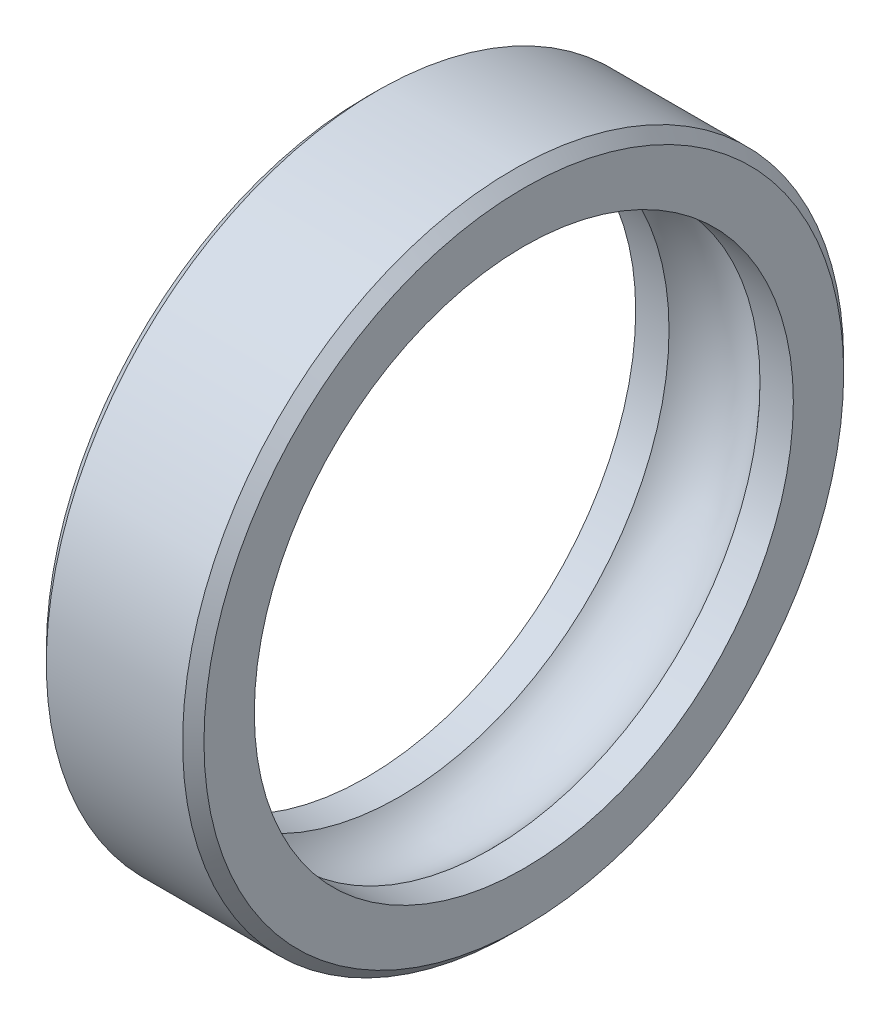
ISO-10303-21;
HEADER;
FILE_DESCRIPTION(('STEP AP214'),'2;1');
FILE_NAME('part.step','',(''),(''),'','','');
FILE_SCHEMA(('AUTOMOTIVE_DESIGN { 1 0 10303 214 1 1 1 1 }'));
ENDSEC;
DATA;
#1=APPLICATION_CONTEXT('core data for automotive mechanical design processes');
#2=APPLICATION_PROTOCOL_DEFINITION('international standard','automotive_design',2000,#1);
#3=PRODUCT_CONTEXT('',#1,'mechanical');
#4=PRODUCT('Part','Part','',(#3));
#5=PRODUCT_RELATED_PRODUCT_CATEGORY('part','',(#4));
#6=PRODUCT_DEFINITION_FORMATION('','',#4);
#7=PRODUCT_DEFINITION_CONTEXT('part definition',#1,'design');
#8=PRODUCT_DEFINITION('design','',#6,#7);
#9=PRODUCT_DEFINITION_SHAPE('','',#8);
#10=(LENGTH_UNIT() NAMED_UNIT(*) SI_UNIT(.MILLI.,.METRE.));
#11=(NAMED_UNIT(*) PLANE_ANGLE_UNIT() SI_UNIT($,.RADIAN.));
#12=(NAMED_UNIT(*) SI_UNIT($,.STERADIAN.) SOLID_ANGLE_UNIT());
#13=UNCERTAINTY_MEASURE_WITH_UNIT(LENGTH_MEASURE(1.E-05),#10,'distance_accuracy_value','');
#14=(GEOMETRIC_REPRESENTATION_CONTEXT(3) GLOBAL_UNCERTAINTY_ASSIGNED_CONTEXT((#13)) GLOBAL_UNIT_ASSIGNED_CONTEXT((#10,
#11,#12)) REPRESENTATION_CONTEXT('',''));
#15=CARTESIAN_POINT('',(0.,0.,0.));
#16=DIRECTION('',(0.,0.,1.));
#17=DIRECTION('',(1.,0.,0.));
#18=AXIS2_PLACEMENT_3D('',#15,#16,#17);
#19=CARTESIAN_POINT('',(-15.5,65.,0.));
#20=DIRECTION('',(1.,0.,0.));
#21=DIRECTION('',(0.,0.,-1.));
#22=AXIS2_PLACEMENT_3D('',#19,#20,#21);
#23=PLANE('',#22);
#24=CARTESIAN_POINT('',(-15.5,0.,0.));
#25=DIRECTION('',(1.,0.,0.));
#26=DIRECTION('',(0.,0.,-1.));
#27=AXIS2_PLACEMENT_3D('',#24,#25,#26);
#28=CIRCLE('',#27,62.9);
#29=CARTESIAN_POINT('',(-15.5,0.,-62.9));
#30=VERTEX_POINT('',#29);
#31=EDGE_CURVE('E50',#30,#30,#28,.F.);
#32=ORIENTED_EDGE('',*,*,#31,.T.);
#33=EDGE_LOOP('',(#32));
#34=FACE_BOUND('',#33,.T.);
#35=CARTESIAN_POINT('',(-15.5,0.,0.));
#36=DIRECTION('',(-1.,0.,0.));
#37=DIRECTION('',(0.,0.,1.));
#38=AXIS2_PLACEMENT_3D('',#35,#36,#37);
#39=CIRCLE('',#38,53.);
#40=CARTESIAN_POINT('',(-15.5,0.,53.));
#41=VERTEX_POINT('',#40);
#42=EDGE_CURVE('E55',#41,#41,#39,.T.);
#43=ORIENTED_EDGE('',*,*,#42,.F.);
#44=EDGE_LOOP('',(#43));
#45=FACE_BOUND('',#44,.T.);
#46=ADVANCED_FACE('F35',(#34,#45),#23,.F.);
#47=CARTESIAN_POINT('',(-21.5841121249226,0.,0.));
#48=DIRECTION('',(-1.,0.,0.));
#49=DIRECTION('',(0.,0.,1.));
#50=AXIS2_PLACEMENT_3D('',#47,#48,#49);
#51=CYLINDRICAL_SURFACE('',#50,53.);
#52=CARTESIAN_POINT('',(-8.94427190999916,0.,0.));
#53=DIRECTION('',(-1.,0.,0.));
#54=DIRECTION('',(0.,0.,1.));
#55=AXIS2_PLACEMENT_3D('',#52,#53,#54);
#56=CIRCLE('',#55,53.);
#57=CARTESIAN_POINT('',(-8.94427190999916,0.,53.));
#58=VERTEX_POINT('',#57);
#59=EDGE_CURVE('E58',#58,#58,#56,.T.);
#60=ORIENTED_EDGE('',*,*,#59,.F.);
#61=EDGE_LOOP('',(#60));
#62=FACE_BOUND('',#61,.T.);
#63=ORIENTED_EDGE('',*,*,#42,.T.);
#64=EDGE_LOOP('',(#63));
#65=FACE_BOUND('',#64,.T.);
#66=ADVANCED_FACE('F78',(#62,#65),#51,.F.);
#67=CARTESIAN_POINT('',(0.,0.,0.));
#68=DIRECTION('',(-1.,0.,0.));
#69=DIRECTION('',(0.,0.,1.));
#70=AXIS2_PLACEMENT_3D('',#67,#68,#69);
#71=TOROIDAL_SURFACE('',#70,45.,12.);
#72=ORIENTED_EDGE('',*,*,#59,.T.);
#73=EDGE_LOOP('',(#72));
#74=FACE_BOUND('',#73,.T.);
#75=CARTESIAN_POINT('',(8.94427190999916,0.,0.));
#76=DIRECTION('',(-1.,0.,0.));
#77=DIRECTION('',(0.,0.,1.));
#78=AXIS2_PLACEMENT_3D('',#75,#76,#77);
#79=CIRCLE('',#78,53.);
#80=CARTESIAN_POINT('',(8.94427190999916,0.,53.));
#81=VERTEX_POINT('',#80);
#82=EDGE_CURVE('E61',#81,#81,#79,.T.);
#83=ORIENTED_EDGE('',*,*,#82,.F.);
#84=EDGE_LOOP('',(#83));
#85=FACE_BOUND('',#84,.T.);
#86=ADVANCED_FACE('F73',(#74,#85),#71,.F.);
#87=CARTESIAN_POINT('',(-21.5841121249226,0.,0.));
#88=DIRECTION('',(-1.,0.,0.));
#89=DIRECTION('',(0.,0.,1.));
#90=AXIS2_PLACEMENT_3D('',#87,#88,#89);
#91=CYLINDRICAL_SURFACE('',#90,53.);
#92=CARTESIAN_POINT('',(15.5,0.,0.));
#93=DIRECTION('',(-1.,0.,0.));
#94=DIRECTION('',(0.,0.,1.));
#95=AXIS2_PLACEMENT_3D('',#92,#93,#94);
#96=CIRCLE('',#95,53.);
#97=CARTESIAN_POINT('',(15.5,0.,53.));
#98=VERTEX_POINT('',#97);
#99=EDGE_CURVE('E64',#98,#98,#96,.T.);
#100=ORIENTED_EDGE('',*,*,#99,.F.);
#101=EDGE_LOOP('',(#100));
#102=FACE_BOUND('',#101,.T.);
#103=ORIENTED_EDGE('',*,*,#82,.T.);
#104=EDGE_LOOP('',(#103));
#105=FACE_BOUND('',#104,.T.);
#106=ADVANCED_FACE('F70',(#102,#105),#91,.F.);
#107=CARTESIAN_POINT('',(15.5,65.,0.));
#108=DIRECTION('',(1.,0.,0.));
#109=DIRECTION('',(0.,0.,-1.));
#110=AXIS2_PLACEMENT_3D('',#107,#108,#109);
#111=PLANE('',#110);
#112=CARTESIAN_POINT('',(15.5,0.,0.));
#113=DIRECTION('',(1.,0.,0.));
#114=DIRECTION('',(0.,0.,-1.));
#115=AXIS2_PLACEMENT_3D('',#112,#113,#114);
#116=CIRCLE('',#115,62.9);
#117=CARTESIAN_POINT('',(15.5,0.,-62.9));
#118=VERTEX_POINT('',#117);
#119=EDGE_CURVE('E10',#118,#118,#116,.T.);
#120=ORIENTED_EDGE('',*,*,#119,.T.);
#121=EDGE_LOOP('',(#120));
#122=FACE_BOUND('',#121,.T.);
#123=ORIENTED_EDGE('',*,*,#99,.T.);
#124=EDGE_LOOP('',(#123));
#125=FACE_BOUND('',#124,.T.);
#126=ADVANCED_FACE('F68',(#122,#125),#111,.T.);
#127=CARTESIAN_POINT('',(-21.5841121249226,0.,0.));
#128=DIRECTION('',(-1.,0.,0.));
#129=DIRECTION('',(0.,0.,1.));
#130=AXIS2_PLACEMENT_3D('',#127,#128,#129);
#131=CYLINDRICAL_SURFACE('',#130,65.);
#132=CARTESIAN_POINT('',(-13.4,0.,0.));
#133=DIRECTION('',(1.,0.,0.));
#134=DIRECTION('',(0.,0.,-1.));
#135=AXIS2_PLACEMENT_3D('',#132,#133,#134);
#136=CIRCLE('',#135,65.);
#137=CARTESIAN_POINT('',(-13.4,0.,-65.));
#138=VERTEX_POINT('',#137);
#139=EDGE_CURVE('E42',#138,#138,#136,.T.);
#140=ORIENTED_EDGE('',*,*,#139,.T.);
#141=EDGE_LOOP('',(#140));
#142=FACE_BOUND('',#141,.T.);
#143=CARTESIAN_POINT('',(13.4,0.,0.));
#144=DIRECTION('',(1.,0.,0.));
#145=DIRECTION('',(0.,0.,-1.));
#146=AXIS2_PLACEMENT_3D('',#143,#144,#145);
#147=CIRCLE('',#146,65.);
#148=CARTESIAN_POINT('',(13.4,0.,-65.));
#149=VERTEX_POINT('',#148);
#150=EDGE_CURVE('E46',#149,#149,#147,.F.);
#151=ORIENTED_EDGE('',*,*,#150,.T.);
#152=EDGE_LOOP('',(#151));
#153=FACE_BOUND('',#152,.T.);
#154=ADVANCED_FACE('F94',(#142,#153),#131,.T.);
#155=CARTESIAN_POINT('',(-15.5,0.,0.));
#156=DIRECTION('',(1.,0.,0.));
#157=DIRECTION('',(0.,0.,-1.));
#158=AXIS2_PLACEMENT_3D('',#155,#156,#157);
#159=CONICAL_SURFACE('',#158,62.9,0.785398163397445);
#160=ORIENTED_EDGE('',*,*,#139,.F.);
#161=EDGE_LOOP('',(#160));
#162=FACE_BOUND('',#161,.T.);
#163=ORIENTED_EDGE('',*,*,#31,.F.);
#164=EDGE_LOOP('',(#163));
#165=FACE_BOUND('',#164,.T.);
#166=ADVANCED_FACE('F92',(#162,#165),#159,.T.);
#167=CARTESIAN_POINT('',(13.4,0.,0.));
#168=DIRECTION('',(-1.,0.,0.));
#169=DIRECTION('',(0.,0.,1.));
#170=AXIS2_PLACEMENT_3D('',#167,#168,#169);
#171=CONICAL_SURFACE('',#170,65.,0.785398163397452);
#172=ORIENTED_EDGE('',*,*,#119,.F.);
#173=EDGE_LOOP('',(#172));
#174=FACE_BOUND('',#173,.T.);
#175=ORIENTED_EDGE('',*,*,#150,.F.);
#176=EDGE_LOOP('',(#175));
#177=FACE_BOUND('',#176,.T.);
#178=ADVANCED_FACE('F37',(#174,#177),#171,.T.);
#179=CLOSED_SHELL('',(#46,#66,#86,#106,#126,#154,#166,#178));
#180=MANIFOLD_SOLID_BREP('B2',#179);
#181=ADVANCED_BREP_SHAPE_REPRESENTATION('',(#18,#180),#14);
#182=SHAPE_DEFINITION_REPRESENTATION(#9,#181);
ENDSEC;
END-ISO-10303-21;
